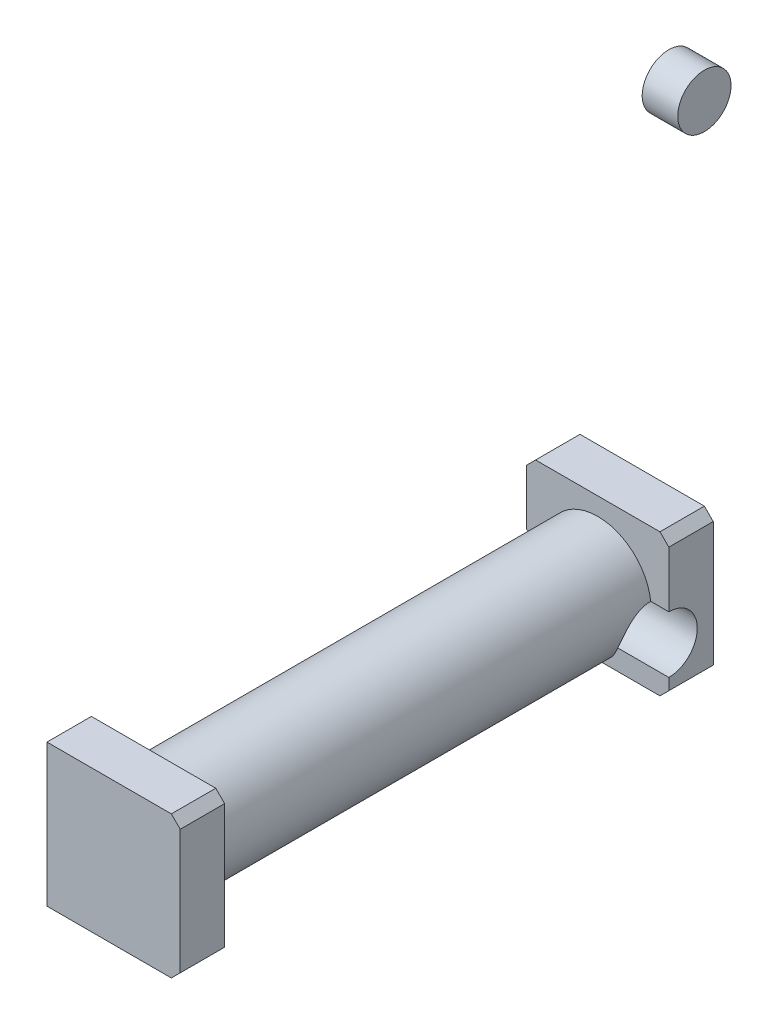
ISO-10303-21;
HEADER;
FILE_DESCRIPTION(('STEP AP214'),'2;1');
FILE_NAME('part.step','',(''),(''),'','','');
FILE_SCHEMA(('AUTOMOTIVE_DESIGN { 1 0 10303 214 1 1 1 1 }'));
ENDSEC;
DATA;
#1=APPLICATION_CONTEXT('core data for automotive mechanical design processes');
#2=APPLICATION_PROTOCOL_DEFINITION('international standard','automotive_design',2000,#1);
#3=PRODUCT_CONTEXT('',#1,'mechanical');
#4=PRODUCT('Part','Part','',(#3));
#5=PRODUCT_RELATED_PRODUCT_CATEGORY('part','',(#4));
#6=PRODUCT_DEFINITION_FORMATION('','',#4);
#7=PRODUCT_DEFINITION_CONTEXT('part definition',#1,'design');
#8=PRODUCT_DEFINITION('design','',#6,#7);
#9=PRODUCT_DEFINITION_SHAPE('','',#8);
#10=(LENGTH_UNIT() NAMED_UNIT(*) SI_UNIT(.MILLI.,.METRE.));
#11=(NAMED_UNIT(*) PLANE_ANGLE_UNIT() SI_UNIT($,.RADIAN.));
#12=(NAMED_UNIT(*) SI_UNIT($,.STERADIAN.) SOLID_ANGLE_UNIT());
#13=UNCERTAINTY_MEASURE_WITH_UNIT(LENGTH_MEASURE(1.E-05),#10,'distance_accuracy_value','');
#14=(GEOMETRIC_REPRESENTATION_CONTEXT(3) GLOBAL_UNCERTAINTY_ASSIGNED_CONTEXT((#13)) GLOBAL_UNIT_ASSIGNED_CONTEXT((#10,
#11,#12)) REPRESENTATION_CONTEXT('',''));
#15=CARTESIAN_POINT('',(0.,0.,0.));
#16=DIRECTION('',(0.,0.,1.));
#17=DIRECTION('',(1.,0.,0.));
#18=AXIS2_PLACEMENT_3D('',#15,#16,#17);
#19=CARTESIAN_POINT('',(60.,262.5,0.));
#20=DIRECTION('',(-1.,0.,0.));
#21=DIRECTION('',(0.,0.,1.));
#22=AXIS2_PLACEMENT_3D('',#19,#20,#21);
#23=CYLINDRICAL_SURFACE('',#22,15.);
#24=CARTESIAN_POINT('',(60.,262.5,0.));
#25=DIRECTION('',(1.,0.,0.));
#26=DIRECTION('',(0.,0.,-1.));
#27=AXIS2_PLACEMENT_3D('',#24,#25,#26);
#28=CIRCLE('',#27,15.);
#29=CARTESIAN_POINT('',(60.,262.5,-15.));
#30=VERTEX_POINT('',#29);
#31=EDGE_CURVE('E11',#30,#30,#28,.T.);
#32=ORIENTED_EDGE('',*,*,#31,.F.);
#33=EDGE_LOOP('',(#32));
#34=FACE_BOUND('',#33,.T.);
#35=CARTESIAN_POINT('',(40.,262.5,0.));
#36=DIRECTION('',(1.,0.,0.));
#37=DIRECTION('',(0.,0.,-1.));
#38=AXIS2_PLACEMENT_3D('',#35,#36,#37);
#39=CIRCLE('',#38,15.);
#40=CARTESIAN_POINT('',(40.,262.5,-15.));
#41=VERTEX_POINT('',#40);
#42=EDGE_CURVE('E55',#41,#41,#39,.T.);
#43=ORIENTED_EDGE('',*,*,#42,.T.);
#44=EDGE_LOOP('',(#43));
#45=FACE_BOUND('',#44,.T.);
#46=ADVANCED_FACE('F47',(#34,#45),#23,.T.);
#47=CARTESIAN_POINT('',(60.,262.5,0.));
#48=DIRECTION('',(1.,0.,0.));
#49=DIRECTION('',(0.,0.,-1.));
#50=AXIS2_PLACEMENT_3D('',#47,#48,#49);
#51=PLANE('',#50);
#52=ORIENTED_EDGE('',*,*,#31,.T.);
#53=EDGE_LOOP('',(#52));
#54=FACE_BOUND('',#53,.T.);
#55=ADVANCED_FACE('F63',(#54),#51,.T.);
#56=CARTESIAN_POINT('',(40.,262.5,0.));
#57=DIRECTION('',(1.,0.,0.));
#58=DIRECTION('',(0.,0.,-1.));
#59=AXIS2_PLACEMENT_3D('',#56,#57,#58);
#60=PLANE('',#59);
#61=ORIENTED_EDGE('',*,*,#42,.F.);
#62=EDGE_LOOP('',(#61));
#63=FACE_BOUND('',#62,.T.);
#64=ADVANCED_FACE('F62',(#63),#60,.F.);
#65=CLOSED_SHELL('',(#46,#55,#64));
#66=MANIFOLD_SOLID_BREP('B2',#65);
#67=CARTESIAN_POINT('',(0.,0.,250.));
#68=DIRECTION('',(0.,0.,-1.));
#69=DIRECTION('',(-1.,0.,0.));
#70=AXIS2_PLACEMENT_3D('',#67,#68,#69);
#71=CYLINDRICAL_SURFACE('',#70,30.);
#72=CARTESIAN_POINT('',(0.,0.,250.));
#73=DIRECTION('',(0.,0.,1.));
#74=DIRECTION('',(1.,0.,0.));
#75=AXIS2_PLACEMENT_3D('',#72,#73,#74);
#76=CIRCLE('',#75,30.);
#77=CARTESIAN_POINT('',(30.,0.,250.));
#78=VERTEX_POINT('',#77);
#79=EDGE_CURVE('E606',#78,#78,#76,.T.);
#80=ORIENTED_EDGE('',*,*,#79,.F.);
#81=EDGE_LOOP('',(#80));
#82=FACE_BOUND('',#81,.T.);
#83=CARTESIAN_POINT('',(29.7951338308792,3.5,0.));
#84=CARTESIAN_POINT('',(29.7951302058021,3.49999989107275,0.2247724718693));
#85=CARTESIAN_POINT('',(29.7956907751452,3.49526274565979,0.449517270771841));
#86=CARTESIAN_POINT('',(29.7979072691116,3.47632761373141,0.898596185354863));
#87=CARTESIAN_POINT('',(29.7995631626717,3.46212989551585,1.122930312501));
#88=CARTESIAN_POINT('',(29.8061229490543,3.40537728290463,1.79466130753126));
#89=CARTESIAN_POINT('',(29.8126189872307,3.34866291203518,2.24092927862479));
#90=CARTESIAN_POINT('',(29.829159637946,3.19795778091047,3.12663281815908));
#91=CARTESIAN_POINT('',(29.8392014431788,3.10399650311835,3.56607350547222));
#92=CARTESIAN_POINT('',(29.8617036026427,2.87947546528195,4.43545539738669));
#93=CARTESIAN_POINT('',(29.8741639642554,2.74891559353306,4.86539657298971));
#94=CARTESIAN_POINT('',(29.8999912923163,2.45208078722622,5.71287444046412));
#95=CARTESIAN_POINT('',(29.9133585209094,2.28579549527832,6.13040749497091));
#96=CARTESIAN_POINT('',(29.9391460173311,1.91869026938024,6.95003635154686));
#97=CARTESIAN_POINT('',(29.9515662891136,1.71787047963816,7.35213221806958));
#98=CARTESIAN_POINT('',(29.9733389929341,1.2830838581949,8.13807617854668));
#99=CARTESIAN_POINT('',(29.982691434489,1.04911712932469,8.52192432910559));
#100=CARTESIAN_POINT('',(29.9960037485337,0.549671207824877,9.26864786505493));
#101=CARTESIAN_POINT('',(29.9999636619576,0.284192254418137,9.63152340962634));
#102=CARTESIAN_POINT('',(30.0000358012158,-0.276160875388557,10.3334050066338));
#103=CARTESIAN_POINT('',(29.9961537645628,-0.57101341074248,10.6724283225984));
#104=CARTESIAN_POINT('',(29.9780550543612,-1.18804217303784,11.324355593285));
#105=CARTESIAN_POINT('',(29.9638383383261,-1.51021851230435,11.6372594406223));
#106=CARTESIAN_POINT('',(29.9226238455085,-2.17917806901273,12.2344430951414));
#107=CARTESIAN_POINT('',(29.8956299575832,-2.52595377211539,12.5187315797845));
#108=CARTESIAN_POINT('',(29.8265630908364,-3.24116487599957,13.0565743794371));
#109=CARTESIAN_POINT('',(29.7844909047036,-3.60959913730749,13.310130309165));
#110=CARTESIAN_POINT('',(29.6855255985349,-4.34762610680263,13.773891405688));
#111=CARTESIAN_POINT('',(29.6293874443306,-4.71641538381683,13.9855370190328));
#112=CARTESIAN_POINT('',(29.5000664166701,-5.4672816907045,14.3777696926685));
#113=CARTESIAN_POINT('',(29.4268841249509,-5.84935826668797,14.5583578126234));
#114=CARTESIAN_POINT('',(29.262445201715,-6.62311635597279,14.8875435648976));
#115=CARTESIAN_POINT('',(29.1711947038106,-7.01479457037984,15.0361520177235));
#116=CARTESIAN_POINT('',(28.969988130381,-7.80420872419767,15.3010743895396));
#117=CARTESIAN_POINT('',(28.860032410445,-8.20194454832146,15.417388922332));
#118=CARTESIAN_POINT('',(28.626378228343,-8.98272614683705,15.6135784369251));
#119=CARTESIAN_POINT('',(28.5034699990086,-9.36567154664133,15.694800673324));
#120=CARTESIAN_POINT('',(28.2406128378191,-10.1307143494138,15.8283690879121));
#121=CARTESIAN_POINT('',(28.1006645396845,-10.5128117833801,15.8807163395624));
#122=CARTESIAN_POINT('',(27.8042482838869,-11.2734389771287,15.9574967986907));
#123=CARTESIAN_POINT('',(27.6477772916832,-11.6519680675989,15.9819248687867));
#124=CARTESIAN_POINT('',(27.3191389864254,-12.4029298718806,16.0041155566643));
#125=CARTESIAN_POINT('',(27.1469708805101,-12.7753622766265,16.0018768267648));
#126=CARTESIAN_POINT('',(26.7772786559417,-13.5338737655765,15.9713366387903));
#127=CARTESIAN_POINT('',(26.5788563051426,-13.9194521460515,15.9414972824313));
#128=CARTESIAN_POINT('',(26.166838608439,-14.679353215093,15.8554931408034));
#129=CARTESIAN_POINT('',(25.9532430750862,-15.0536757645246,15.7993280302604));
#130=CARTESIAN_POINT('',(25.5122450611341,-15.789533064992,15.6626634924661));
#131=CARTESIAN_POINT('',(25.284841468619,-16.1510667824673,15.5821621034153));
#132=CARTESIAN_POINT('',(24.8176147734166,-16.8602021807319,15.3987928467024));
#133=CARTESIAN_POINT('',(24.5777890548595,-17.2078008995056,15.2959202533715));
#134=CARTESIAN_POINT('',(23.9637018049856,-18.0592937822201,15.0128118196233));
#135=CARTESIAN_POINT('',(23.5824612117372,-18.5539239734073,14.8196811797528));
#136=CARTESIAN_POINT('',(22.7993430713558,-19.5082387572356,14.3929856785445));
#137=CARTESIAN_POINT('',(22.3974569967042,-19.9679087120802,14.1594040131024));
#138=CARTESIAN_POINT('',(21.5758248765372,-20.8530477333173,13.6560114943982));
#139=CARTESIAN_POINT('',(21.1560252155853,-21.2784012414525,13.3860857834971));
#140=CARTESIAN_POINT('',(20.3035284019358,-22.0933108974055,12.8146812488988));
#141=CARTESIAN_POINT('',(19.8708324666115,-22.4828704099942,12.5132053967446));
#142=CARTESIAN_POINT('',(19.1569337156101,-23.0899057357592,11.997875446083));
#143=CARTESIAN_POINT('',(18.8785073942753,-23.3180016804496,11.7925461436841));
#144=CARTESIAN_POINT('',(18.3188017277493,-23.7602331429169,11.3710362019904));
#145=CARTESIAN_POINT('',(18.0375224984653,-23.9743692252471,11.1548560021452));
#146=CARTESIAN_POINT('',(17.472860455711,-24.3889712561239,10.711884076407));
#147=CARTESIAN_POINT('',(17.1894763589687,-24.5894279484491,10.4850853370169));
#148=CARTESIAN_POINT('',(16.6218098837883,-24.9766584676974,10.0211917067499));
#149=CARTESIAN_POINT('',(16.3375275350294,-25.1634327418696,9.78409715282522));
#150=CARTESIAN_POINT('',(15.7701118139318,-25.5228523521495,9.30031425865068));
#151=CARTESIAN_POINT('',(15.486977657585,-25.695540630241,9.05365873907093));
#152=CARTESIAN_POINT('',(14.9222968965865,-26.0275298614362,8.54967911206406));
#153=CARTESIAN_POINT('',(14.640750430996,-26.1868296583655,8.29235408612159));
#154=CARTESIAN_POINT('',(14.0812843232476,-26.491863564717,7.76659798189407));
#155=CARTESIAN_POINT('',(13.8033613912529,-26.6376108411585,7.49817805713551));
#156=CARTESIAN_POINT('',(13.2532162751342,-26.9155553128615,6.94885287075693));
#157=CARTESIAN_POINT('',(12.9809926809841,-27.047755891888,6.66795075226071));
#158=CARTESIAN_POINT('',(12.537379301221,-27.2553094445388,6.19058842395876));
#159=CARTESIAN_POINT('',(12.3634316783607,-27.3346073587704,5.99821416299579));
#160=CARTESIAN_POINT('',(12.0207263855173,-27.4870383258235,5.60650249433739));
#161=CARTESIAN_POINT('',(11.851968582398,-27.560171536874,5.407165265546));
#162=CARTESIAN_POINT('',(11.5211066554267,-27.7001157769046,5.00028455797938));
#163=CARTESIAN_POINT('',(11.3590138036035,-27.7669163263117,4.79272825554921));
#164=CARTESIAN_POINT('',(11.0441562688107,-27.8936439546733,4.36860588820196));
#165=CARTESIAN_POINT('',(10.8913902394325,-27.9535720268324,4.15204113135942));
#166=CARTESIAN_POINT('',(10.6281294326372,-28.0545636972614,3.75350577351702));
#167=CARTESIAN_POINT('',(10.5153371622887,-28.096990457212,3.573405141932));
#168=CARTESIAN_POINT('',(10.2999786335482,-28.1766501603835,3.20593129599452));
#169=CARTESIAN_POINT('',(10.1974158393725,-28.2138813458132,3.01855564759789));
#170=CARTESIAN_POINT('',(10.0060278328407,-28.282320864222,2.63734816560651));
#171=CARTESIAN_POINT('',(9.91711792097095,-28.3135666559658,2.44356602650197));
#172=CARTESIAN_POINT('',(9.75573312592517,-28.3695783843826,2.04846252483496));
#173=CARTESIAN_POINT('',(9.68324132497929,-28.3943509953229,1.84714917430049));
#174=CARTESIAN_POINT('',(9.58068861958621,-28.4290732966272,1.51068439905365));
#175=CARTESIAN_POINT('',(9.54471590262643,-28.4411584431212,1.3775454450543));
#176=CARTESIAN_POINT('',(9.48209288259916,-28.4620975931578,1.10886849688622));
#177=CARTESIAN_POINT('',(9.45543906228127,-28.4709528158319,0.973331428179525));
#178=CARTESIAN_POINT('',(9.41203699306046,-28.4853317211325,0.698757221767141));
#179=CARTESIAN_POINT('',(9.39541586655403,-28.4908126655424,0.559697520871033));
#180=CARTESIAN_POINT('',(9.37310435844192,-28.4981568662186,0.280438578678411));
#181=CARTESIAN_POINT('',(9.36742778998066,-28.5000155508567,0.140238121324269));
#182=CARTESIAN_POINT('',(9.36749699759761,-28.5,0.));
#183=B_SPLINE_CURVE_WITH_KNOTS('',3,(#83,#84,#85,#86,#87,#88,#89,#90,#91,#92,#93,#94,#95,#96,
#97,#98,#99,#100,#101,#102,#103,#104,#105,#106,#107,#108,#109,#110,#111,#112,#113,#114,#115,
#116,#117,#118,#119,#120,#121,#122,#123,#124,#125,#126,#127,#128,#129,#130,#131,#132,#133,#134,
#135,#136,#137,#138,#139,#140,#141,#142,#143,#144,#145,#146,#147,#148,#149,#150,#151,#152,#153,
#154,#155,#156,#157,#158,#159,#160,#161,#162,#163,#164,#165,#166,#167,#168,#169,#170,#171,#172,
#173,#174,#175,#176,#177,#178,#179,#180,#181,#182),.UNSPECIFIED.,.F.,.F.,(4,2,2,2,2,2,2,2,2,2,2,
2,2,2,2,2,2,2,2,2,2,2,2,2,2,2,2,2,2,2,2,2,2,2,2,2,2,2,2,2,2,2,2,2,2,2,2,2,2,4),(0.,
0.674211627387335,1.34840413508759,2.69636307118374,4.04325716589245,5.39015537157633,
6.73744459352549,8.0847281896417,9.43200760620304,10.7792767956405,12.1255606212059,
13.4718499814606,14.817729848614,16.1635389712405,17.4485822412495,18.7335816576146,
20.0181456009227,21.3026851271895,22.5322118503028,23.7616928612471,24.9914000714126,
26.2211694285268,27.5238760726426,28.8265988130822,30.1294265968076,31.4325298562469,
33.3906556515306,35.349596848371,37.3148809020913,39.2799800222652,40.5227645261154,
41.7654987390742,43.0090656824457,44.2525919581015,45.4921733613178,46.7318616999566,
47.9703327459604,49.2084936822027,50.0219463157717,50.8353780641275,51.6501332398466,
52.4647705190481,53.1145238820506,53.7644965424529,54.4102580800245,55.0553511448218,
55.4703532760152,55.8851986025758,56.3051956673184,56.7257224649318),.UNSPECIFIED.);
#184=CARTESIAN_POINT('',(29.7951338308792,3.5,0.));
#185=VERTEX_POINT('',#184);
#186=CARTESIAN_POINT('',(9.36749699759761,-28.5,0.));
#187=VERTEX_POINT('',#186);
#188=EDGE_CURVE('E263',#185,#187,#183,.T.);
#189=ORIENTED_EDGE('',*,*,#188,.F.);
#190=CARTESIAN_POINT('',(0.,0.,0.));
#191=DIRECTION('',(0.,0.,1.));
#192=DIRECTION('',(1.,0.,0.));
#193=AXIS2_PLACEMENT_3D('',#190,#191,#192);
#194=CIRCLE('',#193,30.);
#195=CARTESIAN_POINT('',(-29.7951338308792,3.5,0.));
#196=VERTEX_POINT('',#195);
#197=EDGE_CURVE('E614',#185,#196,#194,.T.);
#198=ORIENTED_EDGE('',*,*,#197,.T.);
#199=CARTESIAN_POINT('',(-9.36749699759761,-28.5,0.));
#200=CARTESIAN_POINT('',(-9.36730509635601,-28.500043033046,0.184405952550645));
#201=CARTESIAN_POINT('',(-9.37719095092625,-28.4968139146822,0.368672138536329));
#202=CARTESIAN_POINT('',(-9.41557539926026,-28.4841647636847,0.734507499072422));
#203=CARTESIAN_POINT('',(-9.4440183942645,-28.4747632236204,0.916083078212123));
#204=CARTESIAN_POINT('',(-9.51721198349554,-28.4503783890933,1.27145933463664));
#205=CARTESIAN_POINT('',(-9.56160645917624,-28.4355168385042,1.44534321877144));
#206=CARTESIAN_POINT('',(-9.66461809611776,-28.4006713639103,1.78840394837849));
#207=CARTESIAN_POINT('',(-9.72324662715413,-28.3806833442982,1.95757690987435));
#208=CARTESIAN_POINT('',(-9.88039227592531,-28.3264430131227,2.36254084394402));
#209=CARTESIAN_POINT('',(-9.98520215458421,-28.2897581067487,2.59555667807058));
#210=CARTESIAN_POINT('',(-10.2134109024365,-28.2081713294457,3.0507200865295));
#211=CARTESIAN_POINT('',(-10.3368192605846,-28.1632652615489,3.2728620359101));
#212=CARTESIAN_POINT('',(-10.5989337728686,-28.0656796625672,3.70947314966069));
#213=CARTESIAN_POINT('',(-10.7377921972727,-28.0129206355419,3.92383210283547));
#214=CARTESIAN_POINT('',(-11.0260522040456,-27.9007188175864,4.34338603728277));
#215=CARTESIAN_POINT('',(-11.1754521295731,-27.8412770761323,4.54858245041934));
#216=CARTESIAN_POINT('',(-11.4988185655899,-27.709400415597,4.97279499856701));
#217=CARTESIAN_POINT('',(-11.6736917904621,-27.6362554999427,5.19089500149569));
#218=CARTESIAN_POINT('',(-12.0306041060597,-27.4827644124786,5.61857489928589));
#219=CARTESIAN_POINT('',(-12.2126449488152,-27.4024164737788,5.82815268523421));
#220=CARTESIAN_POINT('',(-12.5821236784303,-27.2347453187766,6.23993087892174));
#221=CARTESIAN_POINT('',(-12.7695657952551,-27.1474165350008,6.44212520705366));
#222=CARTESIAN_POINT('',(-13.1483259710635,-26.9660095846865,6.83975792649377));
#223=CARTESIAN_POINT('',(-13.3396444605924,-26.8719306654345,7.03519556074525));
#224=CARTESIAN_POINT('',(-13.9172241271382,-26.5800026820957,7.6117828991832));
#225=CARTESIAN_POINT('',(-14.3076482078112,-26.3722202561696,7.98379599607425));
#226=CARTESIAN_POINT('',(-15.0932547035916,-25.9306181731214,8.70617146714729));
#227=CARTESIAN_POINT('',(-15.4884350992251,-25.6968092412931,9.05654266788927));
#228=CARTESIAN_POINT('',(-16.3544239023043,-25.1563129939202,9.80141031689915));
#229=CARTESIAN_POINT('',(-16.8254322905811,-24.8441988322271,10.1917578128502));
#230=CARTESIAN_POINT('',(-17.7637083741582,-24.182236365302,10.9442401917897));
#231=CARTESIAN_POINT('',(-18.2309751352222,-23.832378933388,11.306368214416));
#232=CARTESIAN_POINT('',(-19.1571169384329,-23.0944851338642,12.0005541971404));
#233=CARTESIAN_POINT('',(-19.6159967740955,-22.7064714385067,12.3326297916402));
#234=CARTESIAN_POINT('',(-20.5215215855747,-21.8915063180682,12.9639958310656));
#235=CARTESIAN_POINT('',(-20.9681693104348,-21.4645637368073,13.2632936885611));
#236=CARTESIAN_POINT('',(-21.7737637767542,-20.644075577482,13.779299509981));
#237=CARTESIAN_POINT('',(-22.1351562184171,-20.2563978600633,14.0015220727445));
#238=CARTESIAN_POINT('',(-22.8439243318592,-19.4535796374542,14.4170732835128));
#239=CARTESIAN_POINT('',(-23.191300008789,-19.0384391423554,14.610401942135));
#240=CARTESIAN_POINT('',(-23.8688929809842,-18.1816929909109,14.964390886099));
#241=CARTESIAN_POINT('',(-24.1991255865271,-17.7401117349766,15.1250807079098));
#242=CARTESIAN_POINT('',(-24.839710790962,-16.8314448806375,15.4099042111857));
#243=CARTESIAN_POINT('',(-25.1500674765195,-16.3643645618887,15.5340454263727));
#244=CARTESIAN_POINT('',(-25.6914207580083,-15.4971219598848,15.7218101302961));
#245=CARTESIAN_POINT('',(-25.9263549264539,-15.1009250164708,15.7924280502529));
#246=CARTESIAN_POINT('',(-26.3793256133147,-14.2949213447422,15.9042048116118));
#247=CARTESIAN_POINT('',(-26.5973638661744,-13.8851160195776,15.9453666803966));
#248=CARTESIAN_POINT('',(-27.014802066899,-13.0543654902745,15.9958044239904));
#249=CARTESIAN_POINT('',(-27.2142096931096,-12.6334249679481,16.0050934916112));
#250=CARTESIAN_POINT('',(-27.5929926642694,-11.7831794183404,15.989588090816));
#251=CARTESIAN_POINT('',(-27.7723678043008,-11.3538743055482,15.964793273781));
#252=CARTESIAN_POINT('',(-28.1110109134331,-10.4875540467544,15.8789413267424));
#253=CARTESIAN_POINT('',(-28.2701348143959,-10.0505064036566,15.8176402816346));
#254=CARTESIAN_POINT('',(-28.566040869871,-9.17575515670586,15.6571741647314));
#255=CARTESIAN_POINT('',(-28.7028227901699,-8.73805154602482,15.5580086960354));
#256=CARTESIAN_POINT('',(-28.9537552857502,-7.8667370579406,15.3211173543557));
#257=CARTESIAN_POINT('',(-29.0679123972663,-7.43312503306909,15.1834026459405));
#258=CARTESIAN_POINT('',(-29.2740196943816,-6.57469277793248,14.8694163688664));
#259=CARTESIAN_POINT('',(-29.3659720193823,-6.14987170427994,14.6931485178722));
#260=CARTESIAN_POINT('',(-29.5197130147706,-5.36004953781448,14.324438550933));
#261=CARTESIAN_POINT('',(-29.5837129244078,-4.99362868652279,14.1359411042536));
#262=CARTESIAN_POINT('',(-29.6961173773593,-4.27468935924609,13.7300629669484));
#263=CARTESIAN_POINT('',(-29.7445232364604,-3.92216971251624,13.5126847153997));
#264=CARTESIAN_POINT('',(-29.8271961206662,-3.23396421822895,13.0503806894443));
#265=CARTESIAN_POINT('',(-29.8614633284735,-2.89827815319368,12.80545527106));
#266=CARTESIAN_POINT('',(-29.9175684640837,-2.24636546423426,12.2896602481321));
#267=CARTESIAN_POINT('',(-29.9394060234284,-1.9301394174208,12.0187898747675));
#268=CARTESIAN_POINT('',(-29.9725130736447,-1.31977598743893,11.453189595128));
#269=CARTESIAN_POINT('',(-29.983792421724,-1.0256182377175,11.158482223103));
#270=CARTESIAN_POINT('',(-29.9977855656057,-0.461090258061712,10.5469346730875));
#271=CARTESIAN_POINT('',(-30.0004994143888,-0.190719881004203,10.2300946320077));
#272=CARTESIAN_POINT('',(-29.9993512818417,0.324572274770991,9.57620395884825));
#273=CARTESIAN_POINT('',(-29.9954870790528,0.569485426748262,9.23914653629055));
#274=CARTESIAN_POINT('',(-29.9831295704164,1.03224639176411,8.54702405370888));
#275=CARTESIAN_POINT('',(-29.9746361733766,1.25009367151744,8.19195863906326));
#276=CARTESIAN_POINT('',(-29.9543066984367,1.66914378132338,7.44507279380589));
#277=CARTESIAN_POINT('',(-29.9423063514181,1.8686667188321,7.05231313828929));
#278=CARTESIAN_POINT('',(-29.917218157729,2.23466431145343,6.25167584803283));
#279=CARTESIAN_POINT('',(-29.9041301865003,2.40113517391602,5.84379648470626));
#280=CARTESIAN_POINT('',(-29.8786475539629,2.69979470329768,5.01594663589271));
#281=CARTESIAN_POINT('',(-29.8662524414364,2.83200589040841,4.59598429578224));
#282=CARTESIAN_POINT('',(-29.8436155226742,3.06135204322424,3.74670325494764));
#283=CARTESIAN_POINT('',(-29.8333730307825,3.15849818499428,3.3173875816945));
#284=CARTESIAN_POINT('',(-29.8152992817004,3.32501751544652,2.40887984010912));
#285=CARTESIAN_POINT('',(-29.8078104425824,3.39065391149089,1.92898419047869));
#286=CARTESIAN_POINT('',(-29.8002459234164,3.45626217794071,1.20669118760019));
#287=CARTESIAN_POINT('',(-29.7983359322306,3.47265719819271,0.965694064383744));
#288=CARTESIAN_POINT('',(-29.7957773969799,3.4945270596222,0.483143614432605));
#289=CARTESIAN_POINT('',(-29.7951291379345,3.49999943343284,0.241590174363662));
#290=CARTESIAN_POINT('',(-29.7951338308792,3.5,0.));
#291=B_SPLINE_CURVE_WITH_KNOTS('',3,(#199,#200,#201,#202,#203,#204,#205,#206,#207,#208,#209,
#210,#211,#212,#213,#214,#215,#216,#217,#218,#219,#220,#221,#222,#223,#224,#225,#226,#227,#228,
#229,#230,#231,#232,#233,#234,#235,#236,#237,#238,#239,#240,#241,#242,#243,#244,#245,#246,#247,
#248,#249,#250,#251,#252,#253,#254,#255,#256,#257,#258,#259,#260,#261,#262,#263,#264,#265,#266,
#267,#268,#269,#270,#271,#272,#273,#274,#275,#276,#277,#278,#279,#280,#281,#282,#283,#284,#285,
#286,#287,#288,#289,#290),.UNSPECIFIED.,.F.,.F.,(4,2,2,2,2,2,2,2,2,2,2,2,2,2,2,2,2,2,2,2,2,2,2,
2,2,2,2,2,2,2,2,2,2,2,2,2,2,2,2,2,2,2,2,2,2,4),(0.,0.552701967143662,1.10375555018802,
1.64320188712164,2.18308054501463,2.95606717229132,3.72944952132966,4.51127317636249,
5.29297422223584,6.15948851883695,7.02621595466225,7.8936416684885,8.7611642604773,
10.4937122207078,12.2255488379935,14.2841727526816,16.3432955827607,18.4012022020763,
20.4586424678174,22.1813404741276,23.904037847406,25.6251692535105,27.3459456360014,
28.742624202688,30.1391592033544,31.5351160795071,32.9310872339748,34.33649184808,
35.7419111942489,37.1469239255226,38.551801231644,39.8013086898011,41.0507106900247,
42.3000965447078,43.5495194336223,44.7977746872146,46.0460222198965,47.2946913790492,
48.5433851371233,49.8639559979922,51.1846783038812,52.5045302336112,53.8239611228719,
55.2750004972132,55.999471311692,56.7241057617025),.UNSPECIFIED.);
#292=CARTESIAN_POINT('',(-9.36749699759761,-28.5,0.));
#293=VERTEX_POINT('',#292);
#294=EDGE_CURVE('E251',#293,#196,#291,.T.);
#295=ORIENTED_EDGE('',*,*,#294,.F.);
#296=EDGE_CURVE('E617',#293,#187,#194,.T.);
#297=ORIENTED_EDGE('',*,*,#296,.T.);
#298=EDGE_LOOP('',(#189,#198,#295,#297));
#299=FACE_BOUND('',#298,.T.);
#300=ADVANCED_FACE('F89',(#82,#299),#71,.T.);
#301=CARTESIAN_POINT('',(40.,-40.,-25.));
#302=DIRECTION('',(1.,0.,0.));
#303=DIRECTION('',(0.,0.,-1.));
#304=AXIS2_PLACEMENT_3D('',#301,#302,#303);
#305=PLANE('',#304);
#306=DIRECTION('',(0.,1.,0.));
#307=VECTOR('',#306,1.);
#308=CARTESIAN_POINT('',(40.,-40.,-25.));
#309=LINE('',#308,#307);
#310=CARTESIAN_POINT('',(40.,-35.,-25.));
#311=VERTEX_POINT('',#310);
#312=CARTESIAN_POINT('',(40.,35.,-25.));
#313=VERTEX_POINT('',#312);
#314=EDGE_CURVE('E315',#311,#313,#309,.T.);
#315=ORIENTED_EDGE('',*,*,#314,.T.);
#316=DIRECTION('',(0.,0.,1.));
#317=VECTOR('',#316,1.);
#318=CARTESIAN_POINT('',(40.,35.,-25.));
#319=LINE('',#318,#317);
#320=CARTESIAN_POINT('',(40.,35.,0.));
#321=VERTEX_POINT('',#320);
#322=EDGE_CURVE('E312',#313,#321,#319,.T.);
#323=ORIENTED_EDGE('',*,*,#322,.T.);
#324=DIRECTION('',(0.,1.,0.));
#325=VECTOR('',#324,1.);
#326=CARTESIAN_POINT('',(40.,-40.,0.));
#327=LINE('',#326,#325);
#328=CARTESIAN_POINT('',(40.,3.5,0.));
#329=VERTEX_POINT('',#328);
#330=EDGE_CURVE('E587',#329,#321,#327,.T.);
#331=ORIENTED_EDGE('',*,*,#330,.F.);
#332=CARTESIAN_POINT('',(40.,-12.5,0.));
#333=DIRECTION('',(1.,0.,0.));
#334=DIRECTION('',(0.,0.,-1.));
#335=AXIS2_PLACEMENT_3D('',#332,#333,#334);
#336=CIRCLE('',#335,16.);
#337=CARTESIAN_POINT('',(40.,-28.5,0.));
#338=VERTEX_POINT('',#337);
#339=EDGE_CURVE('E253',#338,#329,#336,.T.);
#340=ORIENTED_EDGE('',*,*,#339,.F.);
#341=CARTESIAN_POINT('',(40.,-35.,0.));
#342=VERTEX_POINT('',#341);
#343=EDGE_CURVE('E596',#342,#338,#327,.T.);
#344=ORIENTED_EDGE('',*,*,#343,.F.);
#345=DIRECTION('',(0.,0.,-1.));
#346=VECTOR('',#345,1.);
#347=CARTESIAN_POINT('',(40.,-35.,-25.));
#348=LINE('',#347,#346);
#349=EDGE_CURVE('E317',#342,#311,#348,.T.);
#350=ORIENTED_EDGE('',*,*,#349,.T.);
#351=EDGE_LOOP('',(#315,#323,#331,#340,#344,#350));
#352=FACE_BOUND('',#351,.T.);
#353=ADVANCED_FACE('F292',(#352),#305,.T.);
#354=CARTESIAN_POINT('',(0.,0.,0.));
#355=DIRECTION('',(0.,0.,-1.));
#356=DIRECTION('',(-1.,0.,0.));
#357=AXIS2_PLACEMENT_3D('',#354,#355,#356);
#358=PLANE('',#357);
#359=DIRECTION('',(1.,0.,0.));
#360=VECTOR('',#359,1.);
#361=CARTESIAN_POINT('',(-40.,-40.,0.));
#362=LINE('',#361,#360);
#363=CARTESIAN_POINT('',(-35.,-40.,0.));
#364=VERTEX_POINT('',#363);
#365=CARTESIAN_POINT('',(35.,-40.,0.));
#366=VERTEX_POINT('',#365);
#367=EDGE_CURVE('E325',#364,#366,#362,.T.);
#368=ORIENTED_EDGE('',*,*,#367,.T.);
#369=DIRECTION('',(-0.707106781186546,-0.707106781186549,0.));
#370=VECTOR('',#369,1.);
#371=CARTESIAN_POINT('',(35.,-40.,0.));
#372=LINE('',#371,#370);
#373=EDGE_CURVE('E355',#366,#342,#372,.F.);
#374=ORIENTED_EDGE('',*,*,#373,.T.);
#375=ORIENTED_EDGE('',*,*,#343,.T.);
#376=DIRECTION('',(-1.,0.,0.));
#377=VECTOR('',#376,1.);
#378=CARTESIAN_POINT('',(40.,-28.5,0.));
#379=LINE('',#378,#377);
#380=EDGE_CURVE('E618',#187,#338,#379,.F.);
#381=ORIENTED_EDGE('',*,*,#380,.F.);
#382=ORIENTED_EDGE('',*,*,#296,.F.);
#383=CARTESIAN_POINT('',(-40.,-28.5,0.));
#384=VERTEX_POINT('',#383);
#385=EDGE_CURVE('E332',#384,#293,#379,.F.);
#386=ORIENTED_EDGE('',*,*,#385,.F.);
#387=DIRECTION('',(0.,-1.,0.));
#388=VECTOR('',#387,1.);
#389=CARTESIAN_POINT('',(-40.,-40.,0.));
#390=LINE('',#389,#388);
#391=CARTESIAN_POINT('',(-40.,-35.,0.));
#392=VERTEX_POINT('',#391);
#393=EDGE_CURVE('E603',#384,#392,#390,.T.);
#394=ORIENTED_EDGE('',*,*,#393,.T.);
#395=DIRECTION('',(-0.707106781186549,0.707106781186546,0.));
#396=VECTOR('',#395,1.);
#397=CARTESIAN_POINT('',(-40.,-35.,0.));
#398=LINE('',#397,#396);
#399=EDGE_CURVE('E354',#392,#364,#398,.F.);
#400=ORIENTED_EDGE('',*,*,#399,.T.);
#401=EDGE_LOOP('',(#368,#374,#375,#381,#382,#386,#394,#400));
#402=FACE_BOUND('',#401,.T.);
#403=ADVANCED_FACE('F290',(#402),#358,.F.);
#404=ORIENTED_EDGE('',*,*,#330,.T.);
#405=DIRECTION('',(0.707106781186549,-0.707106781186546,0.));
#406=VECTOR('',#405,1.);
#407=CARTESIAN_POINT('',(40.,35.,0.));
#408=LINE('',#407,#406);
#409=CARTESIAN_POINT('',(35.,40.,0.));
#410=VERTEX_POINT('',#409);
#411=EDGE_CURVE('E330',#321,#410,#408,.F.);
#412=ORIENTED_EDGE('',*,*,#411,.T.);
#413=DIRECTION('',(-1.,0.,0.));
#414=VECTOR('',#413,1.);
#415=CARTESIAN_POINT('',(-40.,40.,0.));
#416=LINE('',#415,#414);
#417=CARTESIAN_POINT('',(-35.,40.,0.));
#418=VERTEX_POINT('',#417);
#419=EDGE_CURVE('E598',#410,#418,#416,.T.);
#420=ORIENTED_EDGE('',*,*,#419,.T.);
#421=DIRECTION('',(0.707106781186546,0.707106781186549,0.));
#422=VECTOR('',#421,1.);
#423=CARTESIAN_POINT('',(-35.,40.,0.));
#424=LINE('',#423,#422);
#425=CARTESIAN_POINT('',(-40.,35.,0.));
#426=VERTEX_POINT('',#425);
#427=EDGE_CURVE('E327',#418,#426,#424,.F.);
#428=ORIENTED_EDGE('',*,*,#427,.T.);
#429=CARTESIAN_POINT('',(-40.,3.5,0.));
#430=VERTEX_POINT('',#429);
#431=EDGE_CURVE('E604',#426,#430,#390,.T.);
#432=ORIENTED_EDGE('',*,*,#431,.T.);
#433=DIRECTION('',(-1.,0.,0.));
#434=VECTOR('',#433,1.);
#435=CARTESIAN_POINT('',(40.,3.5,0.));
#436=LINE('',#435,#434);
#437=EDGE_CURVE('E612',#196,#430,#436,.T.);
#438=ORIENTED_EDGE('',*,*,#437,.F.);
#439=ORIENTED_EDGE('',*,*,#197,.F.);
#440=EDGE_CURVE('E592',#329,#185,#436,.T.);
#441=ORIENTED_EDGE('',*,*,#440,.F.);
#442=EDGE_LOOP('',(#404,#412,#420,#428,#432,#438,#439,#441));
#443=FACE_BOUND('',#442,.T.);
#444=ADVANCED_FACE('F286',(#443),#358,.F.);
#445=CARTESIAN_POINT('',(-40.,-40.,-25.));
#446=DIRECTION('',(0.,-1.,0.));
#447=DIRECTION('',(0.,0.,-1.));
#448=AXIS2_PLACEMENT_3D('',#445,#446,#447);
#449=PLANE('',#448);
#450=DIRECTION('',(1.,0.,0.));
#451=VECTOR('',#450,1.);
#452=CARTESIAN_POINT('',(-40.,-40.,-25.));
#453=LINE('',#452,#451);
#454=CARTESIAN_POINT('',(-35.,-40.,-25.));
#455=VERTEX_POINT('',#454);
#456=CARTESIAN_POINT('',(35.,-40.,-25.));
#457=VERTEX_POINT('',#456);
#458=EDGE_CURVE('E601',#455,#457,#453,.T.);
#459=ORIENTED_EDGE('',*,*,#458,.T.);
#460=DIRECTION('',(0.,0.,1.));
#461=VECTOR('',#460,1.);
#462=CARTESIAN_POINT('',(35.,-40.,-25.));
#463=LINE('',#462,#461);
#464=EDGE_CURVE('E348',#457,#366,#463,.T.);
#465=ORIENTED_EDGE('',*,*,#464,.T.);
#466=ORIENTED_EDGE('',*,*,#367,.F.);
#467=DIRECTION('',(0.,0.,-1.));
#468=VECTOR('',#467,1.);
#469=CARTESIAN_POINT('',(-35.,-40.,-25.));
#470=LINE('',#469,#468);
#471=EDGE_CURVE('E346',#364,#455,#470,.T.);
#472=ORIENTED_EDGE('',*,*,#471,.T.);
#473=EDGE_LOOP('',(#459,#465,#466,#472));
#474=FACE_BOUND('',#473,.T.);
#475=ADVANCED_FACE('F291',(#474),#449,.T.);
#476=CARTESIAN_POINT('',(-40.,-40.,-25.));
#477=DIRECTION('',(-1.,0.,0.));
#478=DIRECTION('',(0.,0.,1.));
#479=AXIS2_PLACEMENT_3D('',#476,#477,#478);
#480=PLANE('',#479);
#481=ORIENTED_EDGE('',*,*,#431,.F.);
#482=DIRECTION('',(0.,0.,-1.));
#483=VECTOR('',#482,1.);
#484=CARTESIAN_POINT('',(-40.,35.,-25.));
#485=LINE('',#484,#483);
#486=CARTESIAN_POINT('',(-40.,35.,-25.));
#487=VERTEX_POINT('',#486);
#488=EDGE_CURVE('E358',#426,#487,#485,.T.);
#489=ORIENTED_EDGE('',*,*,#488,.T.);
#490=DIRECTION('',(0.,-1.,0.));
#491=VECTOR('',#490,1.);
#492=CARTESIAN_POINT('',(-40.,-40.,-25.));
#493=LINE('',#492,#491);
#494=CARTESIAN_POINT('',(-40.,-35.,-25.));
#495=VERTEX_POINT('',#494);
#496=EDGE_CURVE('E637',#487,#495,#493,.T.);
#497=ORIENTED_EDGE('',*,*,#496,.T.);
#498=DIRECTION('',(0.,0.,1.));
#499=VECTOR('',#498,1.);
#500=CARTESIAN_POINT('',(-40.,-35.,-25.));
#501=LINE('',#500,#499);
#502=EDGE_CURVE('E359',#495,#392,#501,.T.);
#503=ORIENTED_EDGE('',*,*,#502,.T.);
#504=ORIENTED_EDGE('',*,*,#393,.F.);
#505=CARTESIAN_POINT('',(-40.,-12.5,0.));
#506=DIRECTION('',(1.,0.,0.));
#507=DIRECTION('',(0.,0.,-1.));
#508=AXIS2_PLACEMENT_3D('',#505,#506,#507);
#509=CIRCLE('',#508,16.);
#510=EDGE_CURVE('E230',#384,#430,#509,.T.);
#511=ORIENTED_EDGE('',*,*,#510,.T.);
#512=EDGE_LOOP('',(#481,#489,#497,#503,#504,#511));
#513=FACE_BOUND('',#512,.T.);
#514=ADVANCED_FACE('F296',(#513),#480,.T.);
#515=CARTESIAN_POINT('',(-40.,40.,-25.));
#516=DIRECTION('',(0.,1.,0.));
#517=DIRECTION('',(0.,0.,1.));
#518=AXIS2_PLACEMENT_3D('',#515,#516,#517);
#519=PLANE('',#518);
#520=ORIENTED_EDGE('',*,*,#419,.F.);
#521=DIRECTION('',(0.,0.,-1.));
#522=VECTOR('',#521,1.);
#523=CARTESIAN_POINT('',(35.,40.,-25.));
#524=LINE('',#523,#522);
#525=CARTESIAN_POINT('',(35.,40.,-25.));
#526=VERTEX_POINT('',#525);
#527=EDGE_CURVE('E338',#410,#526,#524,.T.);
#528=ORIENTED_EDGE('',*,*,#527,.T.);
#529=DIRECTION('',(-1.,0.,0.));
#530=VECTOR('',#529,1.);
#531=CARTESIAN_POINT('',(-40.,40.,-25.));
#532=LINE('',#531,#530);
#533=CARTESIAN_POINT('',(-35.,40.,-25.));
#534=VERTEX_POINT('',#533);
#535=EDGE_CURVE('E321',#526,#534,#532,.T.);
#536=ORIENTED_EDGE('',*,*,#535,.T.);
#537=DIRECTION('',(0.,0.,1.));
#538=VECTOR('',#537,1.);
#539=CARTESIAN_POINT('',(-35.,40.,-25.));
#540=LINE('',#539,#538);
#541=EDGE_CURVE('E336',#534,#418,#540,.T.);
#542=ORIENTED_EDGE('',*,*,#541,.T.);
#543=EDGE_LOOP('',(#520,#528,#536,#542));
#544=FACE_BOUND('',#543,.T.);
#545=ADVANCED_FACE('F285',(#544),#519,.T.);
#546=CARTESIAN_POINT('',(0.,0.,-25.));
#547=DIRECTION('',(0.,0.,-1.));
#548=DIRECTION('',(-1.,0.,0.));
#549=AXIS2_PLACEMENT_3D('',#546,#547,#548);
#550=PLANE('',#549);
#551=ORIENTED_EDGE('',*,*,#535,.F.);
#552=DIRECTION('',(-0.707106781186549,0.707106781186546,0.));
#553=VECTOR('',#552,1.);
#554=CARTESIAN_POINT('',(37.4999999999999,37.5000000000001,-25.));
#555=LINE('',#554,#553);
#556=EDGE_CURVE('E326',#526,#313,#555,.F.);
#557=ORIENTED_EDGE('',*,*,#556,.T.);
#558=ORIENTED_EDGE('',*,*,#314,.F.);
#559=DIRECTION('',(0.707106781186546,0.707106781186549,0.));
#560=VECTOR('',#559,1.);
#561=CARTESIAN_POINT('',(37.5000000000001,-37.4999999999999,-25.));
#562=LINE('',#561,#560);
#563=EDGE_CURVE('E341',#311,#457,#562,.F.);
#564=ORIENTED_EDGE('',*,*,#563,.T.);
#565=ORIENTED_EDGE('',*,*,#458,.F.);
#566=DIRECTION('',(0.707106781186549,-0.707106781186546,0.));
#567=VECTOR('',#566,1.);
#568=CARTESIAN_POINT('',(-37.4999999999999,-37.5000000000001,-25.));
#569=LINE('',#568,#567);
#570=EDGE_CURVE('E342',#455,#495,#569,.F.);
#571=ORIENTED_EDGE('',*,*,#570,.T.);
#572=ORIENTED_EDGE('',*,*,#496,.F.);
#573=DIRECTION('',(-0.707106781186546,-0.707106781186549,0.));
#574=VECTOR('',#573,1.);
#575=CARTESIAN_POINT('',(-37.5000000000001,37.4999999999999,-25.));
#576=LINE('',#575,#574);
#577=EDGE_CURVE('E343',#487,#534,#576,.F.);
#578=ORIENTED_EDGE('',*,*,#577,.T.);
#579=EDGE_LOOP('',(#551,#557,#558,#564,#565,#571,#572,#578));
#580=FACE_BOUND('',#579,.T.);
#581=ADVANCED_FACE('F279',(#580),#550,.T.);
#582=CARTESIAN_POINT('',(40.,-12.5,0.));
#583=DIRECTION('',(-1.,0.,0.));
#584=DIRECTION('',(0.,0.,1.));
#585=AXIS2_PLACEMENT_3D('',#582,#583,#584);
#586=CYLINDRICAL_SURFACE('',#585,16.);
#587=ORIENTED_EDGE('',*,*,#385,.T.);
#588=ORIENTED_EDGE('',*,*,#294,.T.);
#589=ORIENTED_EDGE('',*,*,#437,.T.);
#590=ORIENTED_EDGE('',*,*,#510,.F.);
#591=EDGE_LOOP('',(#587,#588,#589,#590));
#592=FACE_BOUND('',#591,.T.);
#593=ORIENTED_EDGE('',*,*,#380,.T.);
#594=ORIENTED_EDGE('',*,*,#339,.T.);
#595=ORIENTED_EDGE('',*,*,#440,.T.);
#596=ORIENTED_EDGE('',*,*,#188,.T.);
#597=EDGE_LOOP('',(#593,#594,#595,#596));
#598=FACE_BOUND('',#597,.T.);
#599=ADVANCED_FACE('F275',(#592,#598),#586,.F.);
#600=CARTESIAN_POINT('',(40.,35.,-25.));
#601=DIRECTION('',(-0.707106781186545,-0.707106781186549,0.));
#602=DIRECTION('',(0.,0.,1.));
#603=AXIS2_PLACEMENT_3D('',#600,#601,#602);
#604=PLANE('',#603);
#605=ORIENTED_EDGE('',*,*,#556,.F.);
#606=ORIENTED_EDGE('',*,*,#527,.F.);
#607=ORIENTED_EDGE('',*,*,#411,.F.);
#608=ORIENTED_EDGE('',*,*,#322,.F.);
#609=EDGE_LOOP('',(#605,#606,#607,#608));
#610=FACE_BOUND('',#609,.T.);
#611=ADVANCED_FACE('F280',(#610),#604,.F.);
#612=CARTESIAN_POINT('',(35.,-40.,-25.));
#613=DIRECTION('',(-0.707106781186549,0.707106781186545,0.));
#614=DIRECTION('',(0.,0.,1.));
#615=AXIS2_PLACEMENT_3D('',#612,#613,#614);
#616=PLANE('',#615);
#617=ORIENTED_EDGE('',*,*,#563,.F.);
#618=ORIENTED_EDGE('',*,*,#349,.F.);
#619=ORIENTED_EDGE('',*,*,#373,.F.);
#620=ORIENTED_EDGE('',*,*,#464,.F.);
#621=EDGE_LOOP('',(#617,#618,#619,#620));
#622=FACE_BOUND('',#621,.T.);
#623=ADVANCED_FACE('F516',(#622),#616,.F.);
#624=CARTESIAN_POINT('',(-35.,40.,-25.));
#625=DIRECTION('',(0.707106781186549,-0.707106781186545,0.));
#626=DIRECTION('',(0.,0.,1.));
#627=AXIS2_PLACEMENT_3D('',#624,#625,#626);
#628=PLANE('',#627);
#629=ORIENTED_EDGE('',*,*,#577,.F.);
#630=ORIENTED_EDGE('',*,*,#488,.F.);
#631=ORIENTED_EDGE('',*,*,#427,.F.);
#632=ORIENTED_EDGE('',*,*,#541,.F.);
#633=EDGE_LOOP('',(#629,#630,#631,#632));
#634=FACE_BOUND('',#633,.T.);
#635=ADVANCED_FACE('F510',(#634),#628,.F.);
#636=CARTESIAN_POINT('',(-40.,-35.,-25.));
#637=DIRECTION('',(0.707106781186545,0.707106781186549,0.));
#638=DIRECTION('',(0.,0.,1.));
#639=AXIS2_PLACEMENT_3D('',#636,#637,#638);
#640=PLANE('',#639);
#641=ORIENTED_EDGE('',*,*,#570,.F.);
#642=ORIENTED_EDGE('',*,*,#471,.F.);
#643=ORIENTED_EDGE('',*,*,#399,.F.);
#644=ORIENTED_EDGE('',*,*,#502,.F.);
#645=EDGE_LOOP('',(#641,#642,#643,#644));
#646=FACE_BOUND('',#645,.T.);
#647=ADVANCED_FACE('F431',(#646),#640,.F.);
#648=CARTESIAN_POINT('',(40.,-40.,275.));
#649=DIRECTION('',(-1.,0.,0.));
#650=DIRECTION('',(0.,0.,1.));
#651=AXIS2_PLACEMENT_3D('',#648,#649,#650);
#652=PLANE('',#651);
#653=DIRECTION('',(0.,1.,0.));
#654=VECTOR('',#653,1.);
#655=CARTESIAN_POINT('',(40.,-40.,250.));
#656=LINE('',#655,#654);
#657=CARTESIAN_POINT('',(40.,-35.,250.));
#658=VERTEX_POINT('',#657);
#659=CARTESIAN_POINT('',(40.,34.9999999999999,250.));
#660=VERTEX_POINT('',#659);
#661=EDGE_CURVE('E399',#658,#660,#656,.T.);
#662=ORIENTED_EDGE('',*,*,#661,.T.);
#663=DIRECTION('',(0.,0.,1.));
#664=VECTOR('',#663,1.);
#665=CARTESIAN_POINT('',(40.,34.9999999999999,275.));
#666=LINE('',#665,#664);
#667=CARTESIAN_POINT('',(40.,34.9999999999999,275.));
#668=VERTEX_POINT('',#667);
#669=EDGE_CURVE('E374',#660,#668,#666,.T.);
#670=ORIENTED_EDGE('',*,*,#669,.T.);
#671=DIRECTION('',(0.,1.,0.));
#672=VECTOR('',#671,1.);
#673=CARTESIAN_POINT('',(40.,-40.,275.));
#674=LINE('',#673,#672);
#675=CARTESIAN_POINT('',(40.,-35.,275.));
#676=VERTEX_POINT('',#675);
#677=EDGE_CURVE('E243',#676,#668,#674,.T.);
#678=ORIENTED_EDGE('',*,*,#677,.F.);
#679=DIRECTION('',(0.,0.,-1.));
#680=VECTOR('',#679,1.);
#681=CARTESIAN_POINT('',(40.,-35.,275.));
#682=LINE('',#681,#680);
#683=EDGE_CURVE('E375',#676,#658,#682,.T.);
#684=ORIENTED_EDGE('',*,*,#683,.T.);
#685=EDGE_LOOP('',(#662,#670,#678,#684));
#686=FACE_BOUND('',#685,.T.);
#687=ADVANCED_FACE('F278',(#686),#652,.F.);
#688=CARTESIAN_POINT('',(-40.,40.,275.));
#689=DIRECTION('',(0.,-1.,0.));
#690=DIRECTION('',(0.,0.,-1.));
#691=AXIS2_PLACEMENT_3D('',#688,#689,#690);
#692=PLANE('',#691);
#693=DIRECTION('',(-1.,0.,0.));
#694=VECTOR('',#693,1.);
#695=CARTESIAN_POINT('',(-40.,40.,275.));
#696=LINE('',#695,#694);
#697=CARTESIAN_POINT('',(35.,40.,275.));
#698=VERTEX_POINT('',#697);
#699=CARTESIAN_POINT('',(-35.,40.,275.));
#700=VERTEX_POINT('',#699);
#701=EDGE_CURVE('E249',#698,#700,#696,.T.);
#702=ORIENTED_EDGE('',*,*,#701,.F.);
#703=DIRECTION('',(0.,0.,-1.));
#704=VECTOR('',#703,1.);
#705=CARTESIAN_POINT('',(35.,40.,275.));
#706=LINE('',#705,#704);
#707=CARTESIAN_POINT('',(35.,40.,250.));
#708=VERTEX_POINT('',#707);
#709=EDGE_CURVE('E365',#698,#708,#706,.T.);
#710=ORIENTED_EDGE('',*,*,#709,.T.);
#711=DIRECTION('',(-1.,0.,0.));
#712=VECTOR('',#711,1.);
#713=CARTESIAN_POINT('',(-40.,40.,250.));
#714=LINE('',#713,#712);
#715=CARTESIAN_POINT('',(-35.,40.,250.));
#716=VERTEX_POINT('',#715);
#717=EDGE_CURVE('E236',#708,#716,#714,.T.);
#718=ORIENTED_EDGE('',*,*,#717,.T.);
#719=DIRECTION('',(0.,0.,1.));
#720=VECTOR('',#719,1.);
#721=CARTESIAN_POINT('',(-35.,40.,275.));
#722=LINE('',#721,#720);
#723=EDGE_CURVE('E362',#716,#700,#722,.T.);
#724=ORIENTED_EDGE('',*,*,#723,.T.);
#725=EDGE_LOOP('',(#702,#710,#718,#724));
#726=FACE_BOUND('',#725,.T.);
#727=ADVANCED_FACE('F415',(#726),#692,.F.);
#728=CARTESIAN_POINT('',(-40.,-40.,275.));
#729=DIRECTION('',(1.,0.,0.));
#730=DIRECTION('',(0.,0.,-1.));
#731=AXIS2_PLACEMENT_3D('',#728,#729,#730);
#732=PLANE('',#731);
#733=DIRECTION('',(0.,1.,0.));
#734=VECTOR('',#733,1.);
#735=CARTESIAN_POINT('',(-40.,-40.,270.));
#736=LINE('',#735,#734);
#737=CARTESIAN_POINT('',(-40.,-40.,270.));
#738=VERTEX_POINT('',#737);
#739=CARTESIAN_POINT('',(-40.,34.9999999999999,270.));
#740=VERTEX_POINT('',#739);
#741=EDGE_CURVE('E99',#738,#740,#736,.T.);
#742=ORIENTED_EDGE('',*,*,#741,.T.);
#743=DIRECTION('',(0.,0.,-1.));
#744=VECTOR('',#743,1.);
#745=CARTESIAN_POINT('',(-40.,34.9999999999999,275.));
#746=LINE('',#745,#744);
#747=CARTESIAN_POINT('',(-40.,34.9999999999999,250.));
#748=VERTEX_POINT('',#747);
#749=EDGE_CURVE('E50',#740,#748,#746,.T.);
#750=ORIENTED_EDGE('',*,*,#749,.T.);
#751=DIRECTION('',(0.,-1.,0.));
#752=VECTOR('',#751,1.);
#753=CARTESIAN_POINT('',(-40.,-40.,250.));
#754=LINE('',#753,#752);
#755=CARTESIAN_POINT('',(-40.,-40.,250.));
#756=VERTEX_POINT('',#755);
#757=EDGE_CURVE('E234',#748,#756,#754,.T.);
#758=ORIENTED_EDGE('',*,*,#757,.T.);
#759=DIRECTION('',(0.,0.,-1.));
#760=VECTOR('',#759,1.);
#761=CARTESIAN_POINT('',(-40.,-40.,275.));
#762=LINE('',#761,#760);
#763=EDGE_CURVE('E221',#738,#756,#762,.T.);
#764=ORIENTED_EDGE('',*,*,#763,.F.);
#765=EDGE_LOOP('',(#742,#750,#758,#764));
#766=FACE_BOUND('',#765,.T.);
#767=ADVANCED_FACE('F231',(#766),#732,.F.);
#768=CARTESIAN_POINT('',(-40.,-40.,275.));
#769=DIRECTION('',(0.,1.,0.));
#770=DIRECTION('',(0.,0.,1.));
#771=AXIS2_PLACEMENT_3D('',#768,#769,#770);
#772=PLANE('',#771);
#773=DIRECTION('',(1.,0.,0.));
#774=VECTOR('',#773,1.);
#775=CARTESIAN_POINT('',(-40.,-40.,250.));
#776=LINE('',#775,#774);
#777=CARTESIAN_POINT('',(34.9999999999999,-40.,250.));
#778=VERTEX_POINT('',#777);
#779=EDGE_CURVE('E229',#756,#778,#776,.T.);
#780=ORIENTED_EDGE('',*,*,#779,.T.);
#781=DIRECTION('',(0.,0.,1.));
#782=VECTOR('',#781,1.);
#783=CARTESIAN_POINT('',(34.9999999999999,-40.,275.));
#784=LINE('',#783,#782);
#785=CARTESIAN_POINT('',(34.9999999999999,-40.,275.));
#786=VERTEX_POINT('',#785);
#787=EDGE_CURVE('E383',#778,#786,#784,.T.);
#788=ORIENTED_EDGE('',*,*,#787,.T.);
#789=DIRECTION('',(1.,0.,0.));
#790=VECTOR('',#789,1.);
#791=CARTESIAN_POINT('',(-40.,-40.,275.));
#792=LINE('',#791,#790);
#793=CARTESIAN_POINT('',(-35.,-40.,275.));
#794=VERTEX_POINT('',#793);
#795=EDGE_CURVE('E232',#794,#786,#792,.T.);
#796=ORIENTED_EDGE('',*,*,#795,.F.);
#797=DIRECTION('',(0.707106781186544,0.,0.707106781186551));
#798=VECTOR('',#797,1.);
#799=CARTESIAN_POINT('',(-35.,-40.,275.));
#800=LINE('',#799,#798);
#801=EDGE_CURVE('E114',#794,#738,#800,.F.);
#802=ORIENTED_EDGE('',*,*,#801,.T.);
#803=ORIENTED_EDGE('',*,*,#763,.T.);
#804=EDGE_LOOP('',(#780,#788,#796,#802,#803));
#805=FACE_BOUND('',#804,.T.);
#806=ADVANCED_FACE('F226',(#805),#772,.F.);
#807=CARTESIAN_POINT('',(0.,0.,275.));
#808=DIRECTION('',(0.,0.,-1.));
#809=DIRECTION('',(-1.,0.,0.));
#810=AXIS2_PLACEMENT_3D('',#807,#808,#809);
#811=PLANE('',#810);
#812=ORIENTED_EDGE('',*,*,#677,.T.);
#813=DIRECTION('',(0.707106781186544,-0.707106781186551,0.));
#814=VECTOR('',#813,1.);
#815=CARTESIAN_POINT('',(35.,40.,275.));
#816=LINE('',#815,#814);
#817=EDGE_CURVE('E381',#668,#698,#816,.F.);
#818=ORIENTED_EDGE('',*,*,#817,.T.);
#819=ORIENTED_EDGE('',*,*,#701,.T.);
#820=DIRECTION('',(0.,-1.,0.));
#821=VECTOR('',#820,1.);
#822=CARTESIAN_POINT('',(-35.,0.,275.));
#823=LINE('',#822,#821);
#824=EDGE_CURVE('E380',#700,#794,#823,.T.);
#825=ORIENTED_EDGE('',*,*,#824,.T.);
#826=ORIENTED_EDGE('',*,*,#795,.T.);
#827=DIRECTION('',(-0.707106781186551,-0.707106781186544,0.));
#828=VECTOR('',#827,1.);
#829=CARTESIAN_POINT('',(40.,-35.,275.));
#830=LINE('',#829,#828);
#831=EDGE_CURVE('E377',#786,#676,#830,.F.);
#832=ORIENTED_EDGE('',*,*,#831,.T.);
#833=EDGE_LOOP('',(#812,#818,#819,#825,#826,#832));
#834=FACE_BOUND('',#833,.T.);
#835=ADVANCED_FACE('F388',(#834),#811,.F.);
#836=CARTESIAN_POINT('',(0.,0.,250.));
#837=DIRECTION('',(0.,0.,-1.));
#838=DIRECTION('',(-1.,0.,0.));
#839=AXIS2_PLACEMENT_3D('',#836,#837,#838);
#840=PLANE('',#839);
#841=ORIENTED_EDGE('',*,*,#79,.T.);
#842=EDGE_LOOP('',(#841));
#843=FACE_BOUND('',#842,.T.);
#844=ORIENTED_EDGE('',*,*,#717,.F.);
#845=DIRECTION('',(-0.707106781186544,0.707106781186551,0.));
#846=VECTOR('',#845,1.);
#847=CARTESIAN_POINT('',(37.5000000000002,37.4999999999998,250.));
#848=LINE('',#847,#846);
#849=EDGE_CURVE('E367',#708,#660,#848,.F.);
#850=ORIENTED_EDGE('',*,*,#849,.T.);
#851=ORIENTED_EDGE('',*,*,#661,.F.);
#852=DIRECTION('',(0.707106781186551,0.707106781186544,0.));
#853=VECTOR('',#852,1.);
#854=CARTESIAN_POINT('',(37.4999999999998,-37.5000000000002,250.));
#855=LINE('',#854,#853);
#856=EDGE_CURVE('E244',#658,#778,#855,.F.);
#857=ORIENTED_EDGE('',*,*,#856,.T.);
#858=ORIENTED_EDGE('',*,*,#779,.F.);
#859=ORIENTED_EDGE('',*,*,#757,.F.);
#860=DIRECTION('',(-0.707106781186544,-0.707106781186551,0.));
#861=VECTOR('',#860,1.);
#862=CARTESIAN_POINT('',(-37.5000000000002,37.4999999999998,250.));
#863=LINE('',#862,#861);
#864=EDGE_CURVE('E370',#748,#716,#863,.F.);
#865=ORIENTED_EDGE('',*,*,#864,.T.);
#866=EDGE_LOOP('',(#844,#850,#851,#857,#858,#859,#865));
#867=FACE_BOUND('',#866,.T.);
#868=ADVANCED_FACE('F241',(#843,#867),#840,.T.);
#869=CARTESIAN_POINT('',(35.,40.,275.));
#870=DIRECTION('',(-0.707106781186551,-0.707106781186543,0.));
#871=DIRECTION('',(0.,0.,-1.));
#872=AXIS2_PLACEMENT_3D('',#869,#870,#871);
#873=PLANE('',#872);
#874=ORIENTED_EDGE('',*,*,#817,.F.);
#875=ORIENTED_EDGE('',*,*,#669,.F.);
#876=ORIENTED_EDGE('',*,*,#849,.F.);
#877=ORIENTED_EDGE('',*,*,#709,.F.);
#878=EDGE_LOOP('',(#874,#875,#876,#877));
#879=FACE_BOUND('',#878,.T.);
#880=ADVANCED_FACE('F413',(#879),#873,.F.);
#881=CARTESIAN_POINT('',(40.,-35.,275.));
#882=DIRECTION('',(-0.707106781186543,0.707106781186551,0.));
#883=DIRECTION('',(0.,0.,-1.));
#884=AXIS2_PLACEMENT_3D('',#881,#882,#883);
#885=PLANE('',#884);
#886=ORIENTED_EDGE('',*,*,#831,.F.);
#887=ORIENTED_EDGE('',*,*,#787,.F.);
#888=ORIENTED_EDGE('',*,*,#856,.F.);
#889=ORIENTED_EDGE('',*,*,#683,.F.);
#890=EDGE_LOOP('',(#886,#887,#888,#889));
#891=FACE_BOUND('',#890,.T.);
#892=ADVANCED_FACE('F397',(#891),#885,.F.);
#893=CARTESIAN_POINT('',(-35.,0.,275.));
#894=DIRECTION('',(0.707106781186551,0.,-0.707106781186543));
#895=DIRECTION('',(0.,-1.,0.));
#896=AXIS2_PLACEMENT_3D('',#893,#894,#895);
#897=PLANE('',#896);
#898=ORIENTED_EDGE('',*,*,#801,.F.);
#899=ORIENTED_EDGE('',*,*,#824,.F.);
#900=DIRECTION('',(-0.577350269189622,-0.577350269189628,-0.577350269189628));
#901=VECTOR('',#900,1.);
#902=CARTESIAN_POINT('',(-48.3333333333333,26.6666666666666,261.666666666667));
#903=LINE('',#902,#901);
#904=EDGE_CURVE('E92',#740,#700,#903,.F.);
#905=ORIENTED_EDGE('',*,*,#904,.F.);
#906=ORIENTED_EDGE('',*,*,#741,.F.);
#907=EDGE_LOOP('',(#898,#899,#905,#906));
#908=FACE_BOUND('',#907,.T.);
#909=ADVANCED_FACE('F91',(#908),#897,.F.);
#910=CARTESIAN_POINT('',(-40.,34.9999999999999,275.));
#911=DIRECTION('',(0.707106781186551,-0.707106781186543,0.));
#912=DIRECTION('',(0.,0.,-1.));
#913=AXIS2_PLACEMENT_3D('',#910,#911,#912);
#914=PLANE('',#913);
#915=ORIENTED_EDGE('',*,*,#904,.T.);
#916=ORIENTED_EDGE('',*,*,#723,.F.);
#917=ORIENTED_EDGE('',*,*,#864,.F.);
#918=ORIENTED_EDGE('',*,*,#749,.F.);
#919=EDGE_LOOP('',(#915,#916,#917,#918));
#920=FACE_BOUND('',#919,.T.);
#921=ADVANCED_FACE('F414',(#920),#914,.F.);
#922=CLOSED_SHELL('',(#300,#353,#403,#444,#475,#514,#545,#581,#599,#611,#623,#635,#647,#687,
#727,#767,#806,#835,#868,#880,#892,#909,#921));
#923=MANIFOLD_SOLID_BREP('B6',#922);
#924=ADVANCED_BREP_SHAPE_REPRESENTATION('',(#18,#66,#923),#14);
#925=SHAPE_DEFINITION_REPRESENTATION(#9,#924);
ENDSEC;
END-ISO-10303-21;
